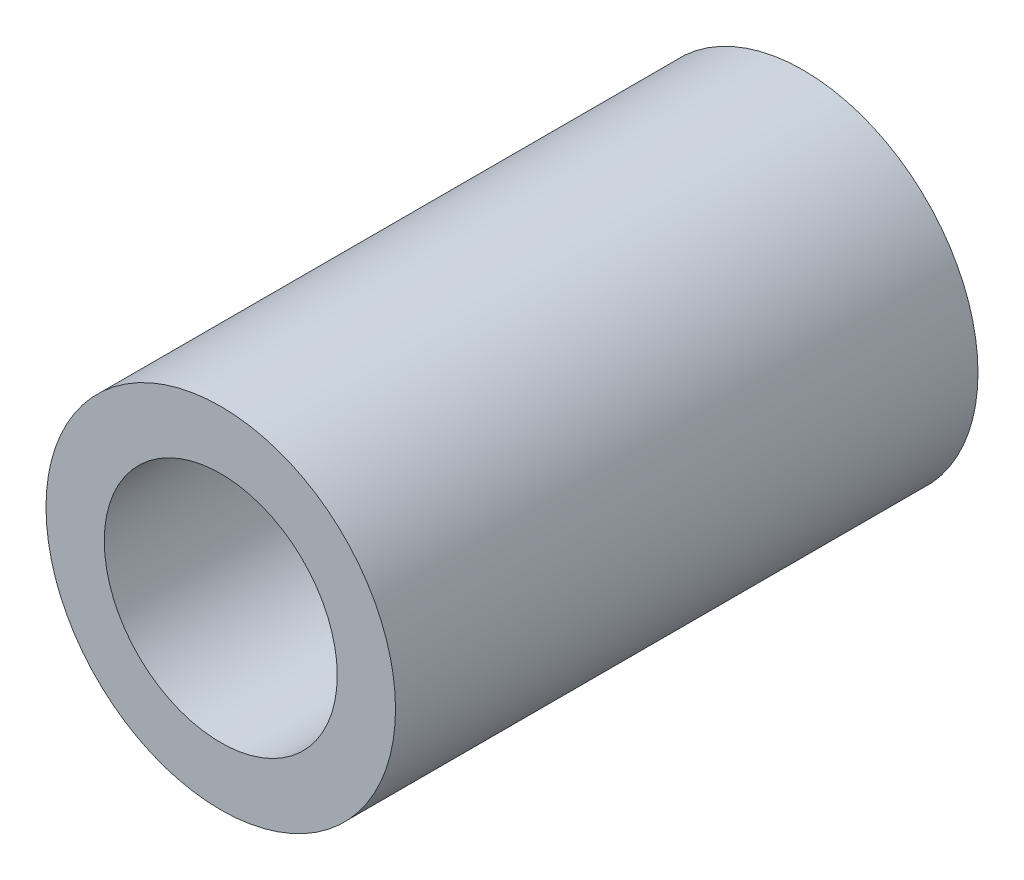
ISO-10303-21;
HEADER;
FILE_DESCRIPTION(('STEP AP214'),'2;1');
FILE_NAME('part.step','',(''),(''),'','','');
FILE_SCHEMA(('AUTOMOTIVE_DESIGN { 1 0 10303 214 1 1 1 1 }'));
ENDSEC;
DATA;
#1=APPLICATION_CONTEXT('core data for automotive mechanical design processes');
#2=APPLICATION_PROTOCOL_DEFINITION('international standard','automotive_design',2000,#1);
#3=PRODUCT_CONTEXT('',#1,'mechanical');
#4=PRODUCT('Part','Part','',(#3));
#5=PRODUCT_RELATED_PRODUCT_CATEGORY('part','',(#4));
#6=PRODUCT_DEFINITION_FORMATION('','',#4);
#7=PRODUCT_DEFINITION_CONTEXT('part definition',#1,'design');
#8=PRODUCT_DEFINITION('design','',#6,#7);
#9=PRODUCT_DEFINITION_SHAPE('','',#8);
#10=(LENGTH_UNIT() NAMED_UNIT(*) SI_UNIT(.MILLI.,.METRE.));
#11=(NAMED_UNIT(*) PLANE_ANGLE_UNIT() SI_UNIT($,.RADIAN.));
#12=(NAMED_UNIT(*) SI_UNIT($,.STERADIAN.) SOLID_ANGLE_UNIT());
#13=UNCERTAINTY_MEASURE_WITH_UNIT(LENGTH_MEASURE(1.E-05),#10,'distance_accuracy_value','');
#14=(GEOMETRIC_REPRESENTATION_CONTEXT(3) GLOBAL_UNCERTAINTY_ASSIGNED_CONTEXT((#13)) GLOBAL_UNIT_ASSIGNED_CONTEXT((#10,
#11,#12)) REPRESENTATION_CONTEXT('',''));
#15=CARTESIAN_POINT('',(0.,0.,0.));
#16=DIRECTION('',(0.,0.,1.));
#17=DIRECTION('',(1.,0.,0.));
#18=AXIS2_PLACEMENT_3D('',#15,#16,#17);
#19=CARTESIAN_POINT('',(0.,0.,127.));
#20=DIRECTION('',(0.,0.,1.));
#21=DIRECTION('',(1.,0.,0.));
#22=AXIS2_PLACEMENT_3D('',#19,#20,#21);
#23=PLANE('',#22);
#24=CARTESIAN_POINT('',(0.,0.,127.));
#25=DIRECTION('',(0.,0.,1.));
#26=DIRECTION('',(1.,0.,0.));
#27=AXIS2_PLACEMENT_3D('',#24,#25,#26);
#28=CIRCLE('',#27,76.2);
#29=CARTESIAN_POINT('',(76.2,0.,127.));
#30=VERTEX_POINT('',#29);
#31=EDGE_CURVE('E10',#30,#30,#28,.T.);
#32=ORIENTED_EDGE('',*,*,#31,.T.);
#33=EDGE_LOOP('',(#32));
#34=FACE_BOUND('',#33,.T.);
#35=CARTESIAN_POINT('',(0.,0.,127.));
#36=DIRECTION('',(0.,0.,1.));
#37=DIRECTION('',(1.,0.,0.));
#38=AXIS2_PLACEMENT_3D('',#35,#36,#37);
#39=CIRCLE('',#38,50.8);
#40=CARTESIAN_POINT('',(50.8,0.,127.));
#41=VERTEX_POINT('',#40);
#42=EDGE_CURVE('E44',#41,#41,#39,.T.);
#43=ORIENTED_EDGE('',*,*,#42,.F.);
#44=EDGE_LOOP('',(#43));
#45=FACE_BOUND('',#44,.T.);
#46=ADVANCED_FACE('F33',(#34,#45),#23,.T.);
#47=CARTESIAN_POINT('',(0.,0.,-127.));
#48=DIRECTION('',(0.,0.,1.));
#49=DIRECTION('',(1.,0.,0.));
#50=AXIS2_PLACEMENT_3D('',#47,#48,#49);
#51=PLANE('',#50);
#52=CARTESIAN_POINT('',(0.,0.,-127.));
#53=DIRECTION('',(0.,0.,1.));
#54=DIRECTION('',(1.,0.,0.));
#55=AXIS2_PLACEMENT_3D('',#52,#53,#54);
#56=CIRCLE('',#55,76.2);
#57=CARTESIAN_POINT('',(76.2,0.,-127.));
#58=VERTEX_POINT('',#57);
#59=EDGE_CURVE('E37',#58,#58,#56,.T.);
#60=ORIENTED_EDGE('',*,*,#59,.F.);
#61=EDGE_LOOP('',(#60));
#62=FACE_BOUND('',#61,.T.);
#63=CARTESIAN_POINT('',(0.,0.,-127.));
#64=DIRECTION('',(0.,0.,1.));
#65=DIRECTION('',(1.,0.,0.));
#66=AXIS2_PLACEMENT_3D('',#63,#64,#65);
#67=CIRCLE('',#66,50.8);
#68=CARTESIAN_POINT('',(50.8,0.,-127.));
#69=VERTEX_POINT('',#68);
#70=EDGE_CURVE('E46',#69,#69,#67,.T.);
#71=ORIENTED_EDGE('',*,*,#70,.T.);
#72=EDGE_LOOP('',(#71));
#73=FACE_BOUND('',#72,.T.);
#74=ADVANCED_FACE('F56',(#62,#73),#51,.F.);
#75=CARTESIAN_POINT('',(0.,0.,127.));
#76=DIRECTION('',(0.,0.,-1.));
#77=DIRECTION('',(-1.,0.,0.));
#78=AXIS2_PLACEMENT_3D('',#75,#76,#77);
#79=CYLINDRICAL_SURFACE('',#78,76.2);
#80=ORIENTED_EDGE('',*,*,#31,.F.);
#81=EDGE_LOOP('',(#80));
#82=FACE_BOUND('',#81,.T.);
#83=ORIENTED_EDGE('',*,*,#59,.T.);
#84=EDGE_LOOP('',(#83));
#85=FACE_BOUND('',#84,.T.);
#86=ADVANCED_FACE('F35',(#82,#85),#79,.T.);
#87=CARTESIAN_POINT('',(0.,0.,127.));
#88=DIRECTION('',(0.,0.,-1.));
#89=DIRECTION('',(-1.,0.,0.));
#90=AXIS2_PLACEMENT_3D('',#87,#88,#89);
#91=CYLINDRICAL_SURFACE('',#90,50.8);
#92=ORIENTED_EDGE('',*,*,#42,.T.);
#93=EDGE_LOOP('',(#92));
#94=FACE_BOUND('',#93,.T.);
#95=ORIENTED_EDGE('',*,*,#70,.F.);
#96=EDGE_LOOP('',(#95));
#97=FACE_BOUND('',#96,.T.);
#98=ADVANCED_FACE('F52',(#94,#97),#91,.F.);
#99=CLOSED_SHELL('',(#46,#74,#86,#98));
#100=MANIFOLD_SOLID_BREP('B2',#99);
#101=ADVANCED_BREP_SHAPE_REPRESENTATION('',(#18,#100),#14);
#102=SHAPE_DEFINITION_REPRESENTATION(#9,#101);
ENDSEC;
END-ISO-10303-21;
